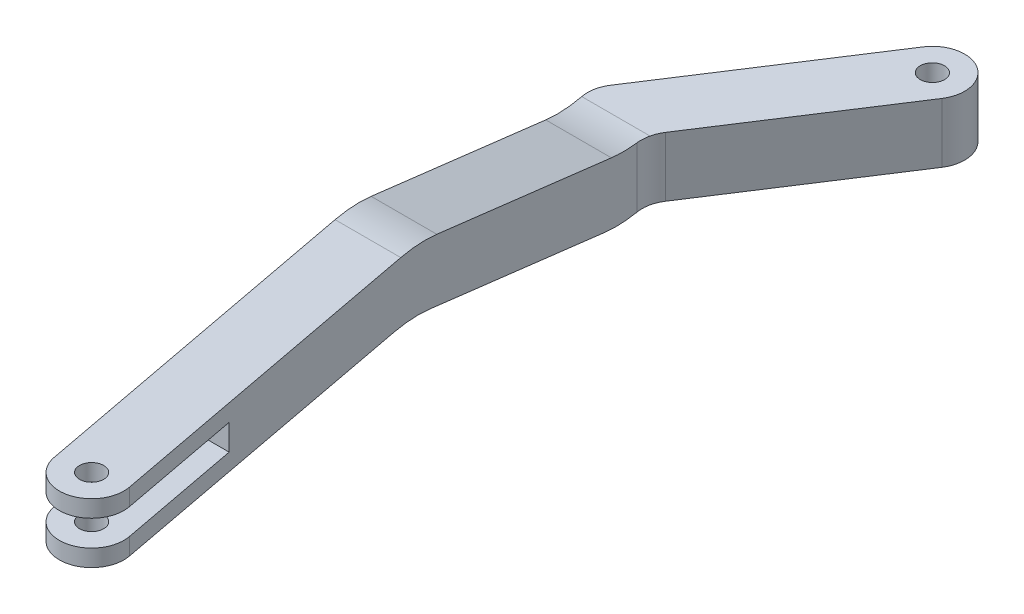
ISO-10303-21;
HEADER;
FILE_DESCRIPTION(('STEP AP214'),'2;1');
FILE_NAME('part.step','',(''),(''),'','','');
FILE_SCHEMA(('AUTOMOTIVE_DESIGN { 1 0 10303 214 1 1 1 1 }'));
ENDSEC;
DATA;
#1=APPLICATION_CONTEXT('core data for automotive mechanical design processes');
#2=APPLICATION_PROTOCOL_DEFINITION('international standard','automotive_design',2000,#1);
#3=PRODUCT_CONTEXT('',#1,'mechanical');
#4=PRODUCT('Part','Part','',(#3));
#5=PRODUCT_RELATED_PRODUCT_CATEGORY('part','',(#4));
#6=PRODUCT_DEFINITION_FORMATION('','',#4);
#7=PRODUCT_DEFINITION_CONTEXT('part definition',#1,'design');
#8=PRODUCT_DEFINITION('design','',#6,#7);
#9=PRODUCT_DEFINITION_SHAPE('','',#8);
#10=(LENGTH_UNIT() NAMED_UNIT(*) SI_UNIT(.MILLI.,.METRE.));
#11=(NAMED_UNIT(*) PLANE_ANGLE_UNIT() SI_UNIT($,.RADIAN.));
#12=(NAMED_UNIT(*) SI_UNIT($,.STERADIAN.) SOLID_ANGLE_UNIT());
#13=UNCERTAINTY_MEASURE_WITH_UNIT(LENGTH_MEASURE(1.E-05),#10,'distance_accuracy_value','');
#14=(GEOMETRIC_REPRESENTATION_CONTEXT(3) GLOBAL_UNCERTAINTY_ASSIGNED_CONTEXT((#13)) GLOBAL_UNIT_ASSIGNED_CONTEXT((#10,
#11,#12)) REPRESENTATION_CONTEXT('',''));
#15=CARTESIAN_POINT('',(0.,0.,0.));
#16=DIRECTION('',(0.,0.,1.));
#17=DIRECTION('',(1.,0.,0.));
#18=AXIS2_PLACEMENT_3D('',#15,#16,#17);
#19=CARTESIAN_POINT('',(10.,6.45,-22.5200010883989));
#20=DIRECTION('',(0.,-0.961261695938321,0.275637355816992));
#21=DIRECTION('',(0.,-0.275637355816992,-0.961261695938321));
#22=AXIS2_PLACEMENT_3D('',#19,#20,#21);
#23=PLANE('',#22);
#24=DIRECTION('',(0.178602453933735,0.271205470906492,0.945805876488001));
#25=VECTOR('',#24,1.);
#26=CARTESIAN_POINT('',(-5.76837346642499,7.23895461904974,-19.7685893543897));
#27=LINE('',#26,#25);
#28=CARTESIAN_POINT('',(-9.06216010888304,2.2373830406168,-37.2111423189214));
#29=VERTEX_POINT('',#28);
#30=CARTESIAN_POINT('',(-6.54305102720159,6.06261695938321,-23.8709662995449));
#31=VERTEX_POINT('',#30);
#32=EDGE_CURVE('E371',#29,#31,#27,.T.);
#33=ORIENTED_EDGE('',*,*,#32,.T.);
#34=DIRECTION('',(-1.,0.,0.));
#35=VECTOR('',#34,1.);
#36=CARTESIAN_POINT('',(10.,6.06261695938321,-23.8709662995449));
#37=LINE('',#36,#35);
#38=CARTESIAN_POINT('',(-2.47235745112013,6.06261695938321,-23.8709662995449));
#39=VERTEX_POINT('',#38);
#40=EDGE_CURVE('E263',#31,#39,#37,.F.);
#41=ORIENTED_EDGE('',*,*,#40,.T.);
#42=DIRECTION('',(-0.178602453933735,-0.271205470906492,-0.945805876488001));
#43=VECTOR('',#42,1.);
#44=CARTESIAN_POINT('',(-1.82753027937678,7.04177851575712,-20.4562241449926));
#45=LINE('',#44,#43);
#46=CARTESIAN_POINT('',(-4.99146653280159,2.2373830406168,-37.2111423189214));
#47=VERTEX_POINT('',#46);
#48=EDGE_CURVE('E167',#39,#47,#45,.T.);
#49=ORIENTED_EDGE('',*,*,#48,.T.);
#50=DIRECTION('',(-1.,0.,0.));
#51=VECTOR('',#50,1.);
#52=CARTESIAN_POINT('',(-9.31727134036083,2.2373830406168,-37.2111423189214));
#53=LINE('',#52,#51);
#54=EDGE_CURVE('E259',#47,#29,#53,.T.);
#55=ORIENTED_EDGE('',*,*,#54,.T.);
#56=EDGE_LOOP('',(#33,#41,#49,#55));
#57=FACE_BOUND('',#56,.T.);
#58=ADVANCED_FACE('F15',(#57),#23,.F.);
#59=CARTESIAN_POINT('',(10.,6.45,5.));
#60=DIRECTION('',(0.,-1.,0.));
#61=DIRECTION('',(0.,0.,-1.));
#62=AXIS2_PLACEMENT_3D('',#59,#60,#61);
#63=PLANE('',#62);
#64=CARTESIAN_POINT('',(0.,6.45,0.));
#65=DIRECTION('',(0.,-1.,0.));
#66=DIRECTION('',(0.,0.,-1.));
#67=AXIS2_PLACEMENT_3D('',#64,#65,#66);
#68=CIRCLE('',#67,0.75);
#69=CARTESIAN_POINT('',(0.,6.45,-0.75));
#70=VERTEX_POINT('',#69);
#71=EDGE_CURVE('E209',#70,#70,#68,.F.);
#72=ORIENTED_EDGE('',*,*,#71,.F.);
#73=EDGE_LOOP('',(#72));
#74=FACE_BOUND('',#73,.T.);
#75=DIRECTION('',(-0.185556850741548,0.,-0.982633530438932));
#76=VECTOR('',#75,1.);
#77=CARTESIAN_POINT('',(3.22125242615556,6.45,6.28007340764427));
#78=LINE('',#77,#76);
#79=CARTESIAN_POINT('',(1.96526706087786,6.45,-0.371113701483095));
#80=VERTEX_POINT('',#79);
#81=CARTESIAN_POINT('',(-1.95185414945403,6.45,-21.1145927413749));
#82=VERTEX_POINT('',#81);
#83=EDGE_CURVE('E153',#80,#82,#78,.T.);
#84=ORIENTED_EDGE('',*,*,#83,.T.);
#85=DIRECTION('',(-1.,0.,0.));
#86=VECTOR('',#85,1.);
#87=CARTESIAN_POINT('',(10.,6.45,-21.1145927413749));
#88=LINE('',#87,#86);
#89=CARTESIAN_POINT('',(-6.02254772553548,6.45,-21.1145927413749));
#90=VERTEX_POINT('',#89);
#91=EDGE_CURVE('E250',#82,#90,#88,.T.);
#92=ORIENTED_EDGE('',*,*,#91,.T.);
#93=DIRECTION('',(0.185556850741548,0.,0.982633530438932));
#94=VECTOR('',#93,1.);
#95=CARTESIAN_POINT('',(-0.709281695600169,6.45,7.02230081061046));
#96=LINE('',#95,#94);
#97=CARTESIAN_POINT('',(-1.96526706087786,6.45,0.371113701483095));
#98=VERTEX_POINT('',#97);
#99=EDGE_CURVE('E183',#90,#98,#96,.T.);
#100=ORIENTED_EDGE('',*,*,#99,.T.);
#101=CARTESIAN_POINT('',(0.,6.45,0.));
#102=DIRECTION('',(0.,-1.,0.));
#103=DIRECTION('',(0.,0.,-1.));
#104=AXIS2_PLACEMENT_3D('',#101,#102,#103);
#105=CIRCLE('',#104,2.);
#106=EDGE_CURVE('E173',#98,#80,#105,.F.);
#107=ORIENTED_EDGE('',*,*,#106,.T.);
#108=EDGE_LOOP('',(#84,#92,#100,#107));
#109=FACE_BOUND('',#108,.T.);
#110=ADVANCED_FACE('F181',(#74,#109),#63,.F.);
#111=CARTESIAN_POINT('',(10.,5.4,-8.));
#112=DIRECTION('',(0.,1.,0.));
#113=DIRECTION('',(0.,0.,1.));
#114=AXIS2_PLACEMENT_3D('',#111,#112,#113);
#115=PLANE('',#114);
#116=CARTESIAN_POINT('',(0.,5.4,0.));
#117=DIRECTION('',(0.,1.,0.));
#118=DIRECTION('',(0.,0.,1.));
#119=AXIS2_PLACEMENT_3D('',#116,#117,#118);
#120=CIRCLE('',#119,0.75);
#121=CARTESIAN_POINT('',(0.,5.4,0.75));
#122=VERTEX_POINT('',#121);
#123=EDGE_CURVE('E205',#122,#122,#120,.F.);
#124=ORIENTED_EDGE('',*,*,#123,.F.);
#125=EDGE_LOOP('',(#124));
#126=FACE_BOUND('',#125,.T.);
#127=CARTESIAN_POINT('',(0.,5.4,0.));
#128=DIRECTION('',(0.,1.,0.));
#129=DIRECTION('',(0.,0.,1.));
#130=AXIS2_PLACEMENT_3D('',#127,#128,#129);
#131=CIRCLE('',#130,2.);
#132=CARTESIAN_POINT('',(1.96526706087786,5.4,-0.371113701483095));
#133=VERTEX_POINT('',#132);
#134=CARTESIAN_POINT('',(-1.96526706087786,5.4,0.371113701483095));
#135=VERTEX_POINT('',#134);
#136=EDGE_CURVE('E176',#133,#135,#131,.F.);
#137=ORIENTED_EDGE('',*,*,#136,.T.);
#138=DIRECTION('',(-0.185556850741548,0.,-0.982633530438932));
#139=VECTOR('',#138,1.);
#140=CARTESIAN_POINT('',(-3.07962867903703,5.4,-5.53009170624697));
#141=LINE('',#140,#139);
#142=CARTESIAN_POINT('',(-3.54603694866378,5.4,-8.));
#143=VERTEX_POINT('',#142);
#144=EDGE_CURVE('E389',#135,#143,#141,.T.);
#145=ORIENTED_EDGE('',*,*,#144,.T.);
#146=DIRECTION('',(-1.,0.,0.));
#147=VECTOR('',#146,1.);
#148=CARTESIAN_POINT('',(10.,5.4,-8.));
#149=LINE('',#148,#147);
#150=CARTESIAN_POINT('',(0.524656627417675,5.4,-8.));
#151=VERTEX_POINT('',#150);
#152=EDGE_CURVE('E217',#151,#143,#149,.T.);
#153=ORIENTED_EDGE('',*,*,#152,.F.);
#154=DIRECTION('',(0.185556850741548,0.,0.982633530438932));
#155=VECTOR('',#154,1.);
#156=CARTESIAN_POINT('',(0.850905442718694,5.4,-6.27231910921316));
#157=LINE('',#156,#155);
#158=EDGE_CURVE('E368',#151,#133,#157,.T.);
#159=ORIENTED_EDGE('',*,*,#158,.T.);
#160=EDGE_LOOP('',(#137,#145,#153,#159));
#161=FACE_BOUND('',#160,.T.);
#162=ADVANCED_FACE('F474',(#126,#161),#115,.F.);
#163=CARTESIAN_POINT('',(10.,3.8,-8.));
#164=DIRECTION('',(0.,0.,-1.));
#165=DIRECTION('',(-1.,0.,0.));
#166=AXIS2_PLACEMENT_3D('',#163,#164,#165);
#167=PLANE('',#166);
#168=ORIENTED_EDGE('',*,*,#152,.T.);
#169=DIRECTION('',(0.,-1.,0.));
#170=VECTOR('',#169,1.);
#171=CARTESIAN_POINT('',(-3.54603694866378,3.8,-8.));
#172=LINE('',#171,#170);
#173=CARTESIAN_POINT('',(-3.54603694866378,3.8,-8.));
#174=VERTEX_POINT('',#173);
#175=EDGE_CURVE('E385',#143,#174,#172,.T.);
#176=ORIENTED_EDGE('',*,*,#175,.T.);
#177=DIRECTION('',(-1.,0.,0.));
#178=VECTOR('',#177,1.);
#179=CARTESIAN_POINT('',(10.,3.8,-8.));
#180=LINE('',#179,#178);
#181=CARTESIAN_POINT('',(0.524656627417677,3.8,-8.));
#182=VERTEX_POINT('',#181);
#183=EDGE_CURVE('E213',#182,#174,#180,.T.);
#184=ORIENTED_EDGE('',*,*,#183,.F.);
#185=DIRECTION('',(0.,1.,0.));
#186=VECTOR('',#185,1.);
#187=CARTESIAN_POINT('',(0.524656627417675,3.8,-8.));
#188=LINE('',#187,#186);
#189=EDGE_CURVE('E364',#182,#151,#188,.T.);
#190=ORIENTED_EDGE('',*,*,#189,.T.);
#191=EDGE_LOOP('',(#168,#176,#184,#190));
#192=FACE_BOUND('',#191,.T.);
#193=ADVANCED_FACE('F472',(#192),#167,.F.);
#194=CARTESIAN_POINT('',(10.,3.8,5.));
#195=DIRECTION('',(0.,-1.,0.));
#196=DIRECTION('',(0.,0.,-1.));
#197=AXIS2_PLACEMENT_3D('',#194,#195,#196);
#198=PLANE('',#197);
#199=CARTESIAN_POINT('',(0.,3.8,0.));
#200=DIRECTION('',(0.,-1.,0.));
#201=DIRECTION('',(0.,0.,-1.));
#202=AXIS2_PLACEMENT_3D('',#199,#200,#201);
#203=CIRCLE('',#202,0.75);
#204=CARTESIAN_POINT('',(0.,3.8,-0.75));
#205=VERTEX_POINT('',#204);
#206=EDGE_CURVE('E201',#205,#205,#203,.F.);
#207=ORIENTED_EDGE('',*,*,#206,.F.);
#208=EDGE_LOOP('',(#207));
#209=FACE_BOUND('',#208,.T.);
#210=ORIENTED_EDGE('',*,*,#183,.T.);
#211=DIRECTION('',(0.185556850741548,0.,0.982633530438932));
#212=VECTOR('',#211,1.);
#213=CARTESIAN_POINT('',(-0.709281695600169,3.8,7.02230081061046));
#214=LINE('',#213,#212);
#215=CARTESIAN_POINT('',(-1.96526706087786,3.8,0.371113701483095));
#216=VERTEX_POINT('',#215);
#217=EDGE_CURVE('E342',#174,#216,#214,.T.);
#218=ORIENTED_EDGE('',*,*,#217,.T.);
#219=CARTESIAN_POINT('',(0.,3.8,0.));
#220=DIRECTION('',(0.,-1.,0.));
#221=DIRECTION('',(0.,0.,-1.));
#222=AXIS2_PLACEMENT_3D('',#219,#220,#221);
#223=CIRCLE('',#222,2.);
#224=CARTESIAN_POINT('',(1.96526706087786,3.8,-0.371113701483095));
#225=VERTEX_POINT('',#224);
#226=EDGE_CURVE('E193',#216,#225,#223,.F.);
#227=ORIENTED_EDGE('',*,*,#226,.T.);
#228=DIRECTION('',(-0.185556850741548,0.,-0.982633530438932));
#229=VECTOR('',#228,1.);
#230=CARTESIAN_POINT('',(3.22125242615556,3.8,6.28007340764427));
#231=LINE('',#230,#229);
#232=EDGE_CURVE('E357',#225,#182,#231,.T.);
#233=ORIENTED_EDGE('',*,*,#232,.T.);
#234=EDGE_LOOP('',(#210,#218,#227,#233));
#235=FACE_BOUND('',#234,.T.);
#236=ADVANCED_FACE('F415',(#209,#235),#198,.F.);
#237=CARTESIAN_POINT('',(10.,2.75,-22.));
#238=DIRECTION('',(0.,1.,0.));
#239=DIRECTION('',(0.,0.,1.));
#240=AXIS2_PLACEMENT_3D('',#237,#238,#239);
#241=PLANE('',#240);
#242=CARTESIAN_POINT('',(0.,2.75,0.));
#243=DIRECTION('',(0.,1.,0.));
#244=DIRECTION('',(0.,0.,1.));
#245=AXIS2_PLACEMENT_3D('',#242,#243,#244);
#246=CIRCLE('',#245,0.75);
#247=CARTESIAN_POINT('',(0.,2.75,0.75));
#248=VERTEX_POINT('',#247);
#249=EDGE_CURVE('E200',#248,#248,#246,.F.);
#250=ORIENTED_EDGE('',*,*,#249,.F.);
#251=EDGE_LOOP('',(#250));
#252=FACE_BOUND('',#251,.T.);
#253=DIRECTION('',(-0.185556850741548,0.,-0.982633530438932));
#254=VECTOR('',#253,1.);
#255=CARTESIAN_POINT('',(-5.63231004581519,2.75,-19.0480528782472));
#256=LINE('',#255,#254);
#257=CARTESIAN_POINT('',(-1.96526706087786,2.75,0.371113701483095));
#258=VERTEX_POINT('',#257);
#259=CARTESIAN_POINT('',(-5.9243526595658,2.75,-20.5945916529761));
#260=VERTEX_POINT('',#259);
#261=EDGE_CURVE('E330',#258,#260,#256,.T.);
#262=ORIENTED_EDGE('',*,*,#261,.T.);
#263=DIRECTION('',(-1.,0.,0.));
#264=VECTOR('',#263,1.);
#265=CARTESIAN_POINT('',(-2.11905115367266,2.75,-20.5945916529761));
#266=LINE('',#265,#264);
#267=CARTESIAN_POINT('',(-1.85365908348435,2.75,-20.5945916529761));
#268=VERTEX_POINT('',#267);
#269=EDGE_CURVE('E278',#260,#268,#266,.F.);
#270=ORIENTED_EDGE('',*,*,#269,.T.);
#271=DIRECTION('',(0.185556850741548,0.,0.982633530438932));
#272=VECTOR('',#271,1.);
#273=CARTESIAN_POINT('',(-1.70177592405946,2.75,-19.7902802812134));
#274=LINE('',#273,#272);
#275=CARTESIAN_POINT('',(1.96526706087786,2.75,-0.371113701483095));
#276=VERTEX_POINT('',#275);
#277=EDGE_CURVE('E350',#268,#276,#274,.T.);
#278=ORIENTED_EDGE('',*,*,#277,.T.);
#279=CARTESIAN_POINT('',(0.,2.75,0.));
#280=DIRECTION('',(0.,1.,0.));
#281=DIRECTION('',(0.,0.,1.));
#282=AXIS2_PLACEMENT_3D('',#279,#280,#281);
#283=CIRCLE('',#282,2.);
#284=EDGE_CURVE('E246',#276,#258,#283,.F.);
#285=ORIENTED_EDGE('',*,*,#284,.T.);
#286=EDGE_LOOP('',(#262,#270,#278,#285));
#287=FACE_BOUND('',#286,.T.);
#288=ADVANCED_FACE('F338',(#252,#287),#241,.F.);
#289=CARTESIAN_POINT('',(10.,-1.85,-38.0421064416686));
#290=DIRECTION('',(0.,0.961261695938321,-0.275637355816992));
#291=DIRECTION('',(0.,0.275637355816992,0.961261695938321));
#292=AXIS2_PLACEMENT_3D('',#289,#290,#291);
#293=PLANE('',#292);
#294=DIRECTION('',(0.178602453933735,0.271205470906492,0.945805876488001));
#295=VECTOR('',#294,1.);
#296=CARTESIAN_POINT('',(-4.66516691460203,-1.1162432050429,-35.4831923966687));
#297=LINE('',#296,#295);
#298=CARTESIAN_POINT('',(-4.89327146683191,-1.46261695938321,-36.6911412305225));
#299=VERTEX_POINT('',#298);
#300=CARTESIAN_POINT('',(-2.37416238515046,2.36261695938321,-23.3509652111461));
#301=VERTEX_POINT('',#300);
#302=EDGE_CURVE('E166',#299,#301,#297,.T.);
#303=ORIENTED_EDGE('',*,*,#302,.T.);
#304=DIRECTION('',(-1.,0.,0.));
#305=VECTOR('',#304,1.);
#306=CARTESIAN_POINT('',(-6.18974472975411,2.36261695938321,-23.3509652111461));
#307=LINE('',#306,#305);
#308=CARTESIAN_POINT('',(-6.4448559612319,2.36261695938321,-23.3509652111461));
#309=VERTEX_POINT('',#308);
#310=EDGE_CURVE('E274',#301,#309,#307,.T.);
#311=ORIENTED_EDGE('',*,*,#310,.T.);
#312=DIRECTION('',(-0.178602453933735,-0.271205470906492,-0.945805876488001));
#313=VECTOR('',#312,1.);
#314=CARTESIAN_POINT('',(-8.60601010165023,-0.919067101750281,-34.7955576060657));
#315=LINE('',#314,#313);
#316=CARTESIAN_POINT('',(-8.96396504291336,-1.46261695938321,-36.6911412305225));
#317=VERTEX_POINT('',#316);
#318=EDGE_CURVE('E333',#309,#317,#315,.T.);
#319=ORIENTED_EDGE('',*,*,#318,.T.);
#320=DIRECTION('',(-1.,0.,0.));
#321=VECTOR('',#320,1.);
#322=CARTESIAN_POINT('',(10.,-1.46261695938321,-36.6911412305225));
#323=LINE('',#322,#321);
#324=EDGE_CURVE('E271',#317,#299,#323,.F.);
#325=ORIENTED_EDGE('',*,*,#324,.T.);
#326=EDGE_LOOP('',(#303,#311,#319,#325));
#327=FACE_BOUND('',#326,.T.);
#328=ADVANCED_FACE('F352',(#327),#293,.F.);
#329=CARTESIAN_POINT('',(10.,-1.85,-57.12));
#330=DIRECTION('',(0.,1.,0.));
#331=DIRECTION('',(0.,0.,1.));
#332=AXIS2_PLACEMENT_3D('',#329,#330,#331);
#333=PLANE('',#332);
#334=CARTESIAN_POINT('',(0.,-1.85,-52.12));
#335=DIRECTION('',(0.,1.,0.));
#336=DIRECTION('',(0.,0.,1.));
#337=AXIS2_PLACEMENT_3D('',#334,#335,#336);
#338=CIRCLE('',#337,0.75);
#339=CARTESIAN_POINT('',(0.,-1.85,-51.37));
#340=VERTEX_POINT('',#339);
#341=EDGE_CURVE('E191',#340,#340,#338,.F.);
#342=ORIENTED_EDGE('',*,*,#341,.F.);
#343=EDGE_LOOP('',(#342));
#344=FACE_BOUND('',#343,.T.);
#345=CARTESIAN_POINT('',(-3.39683910958896,-1.85,-39.5450126323222));
#346=DIRECTION('',(0.,1.,0.));
#347=DIRECTION('',(0.,0.,1.));
#348=AXIS2_PLACEMENT_3D('',#345,#346,#347);
#349=CIRCLE('',#348,2.);
#350=CARTESIAN_POINT('',(-5.07418024547981,-1.85,-40.6342907023522));
#351=VERTEX_POINT('',#350);
#352=CARTESIAN_POINT('',(-5.39446123864329,-1.85,-39.4475147886925));
#353=VERTEX_POINT('',#352);
#354=EDGE_CURVE('E409',#351,#353,#349,.T.);
#355=ORIENTED_EDGE('',*,*,#354,.T.);
#356=DIRECTION('',(-1.,0.,0.));
#357=VECTOR('',#356,1.);
#358=CARTESIAN_POINT('',(10.,-1.85,-39.4475147886925));
#359=LINE('',#358,#357);
#360=CARTESIAN_POINT('',(-9.48446834457947,-1.85,-39.4475147886925));
#361=VERTEX_POINT('',#360);
#362=EDGE_CURVE('E281',#353,#361,#359,.T.);
#363=ORIENTED_EDGE('',*,*,#362,.T.);
#364=DIRECTION('',(-0.185556850741548,0.,-0.982633530438932));
#365=VECTOR('',#364,1.);
#366=CARTESIAN_POINT('',(-12.0358935887615,-1.85,-52.9588240468652));
#367=LINE('',#366,#365);
#368=CARTESIAN_POINT('',(-9.59021355108826,-1.85,-40.007498347281));
#369=VERTEX_POINT('',#368);
#370=EDGE_CURVE('E377',#361,#369,#367,.T.);
#371=ORIENTED_EDGE('',*,*,#370,.T.);
#372=CARTESIAN_POINT('',(-7.62494649021039,-1.85,-40.378612048764));
#373=DIRECTION('',(0.,1.,0.));
#374=DIRECTION('',(0.,0.,1.));
#375=AXIS2_PLACEMENT_3D('',#372,#373,#374);
#376=CIRCLE('',#375,2.);
#377=CARTESIAN_POINT('',(-9.30228762610125,-1.85,-41.4678901187941));
#378=VERTEX_POINT('',#377);
#379=EDGE_CURVE('E393',#369,#378,#376,.F.);
#380=ORIENTED_EDGE('',*,*,#379,.T.);
#381=DIRECTION('',(0.544639035015028,0.,-0.838670567945423));
#382=VECTOR('',#381,1.);
#383=CARTESIAN_POINT('',(3.57283929283667,-1.85,-61.2938469659326));
#384=LINE('',#383,#382);
#385=CARTESIAN_POINT('',(-1.67734113589084,-1.85,-53.2092780700301));
#386=VERTEX_POINT('',#385);
#387=EDGE_CURVE('E397',#378,#386,#384,.T.);
#388=ORIENTED_EDGE('',*,*,#387,.T.);
#389=CARTESIAN_POINT('',(0.,-1.85,-52.12));
#390=DIRECTION('',(0.,1.,0.));
#391=DIRECTION('',(0.,0.,1.));
#392=AXIS2_PLACEMENT_3D('',#389,#390,#391);
#393=CIRCLE('',#392,2.);
#394=CARTESIAN_POINT('',(1.67734113589085,-1.85,-51.03072192997));
#395=VERTEX_POINT('',#394);
#396=EDGE_CURVE('E401',#386,#395,#393,.F.);
#397=ORIENTED_EDGE('',*,*,#396,.T.);
#398=DIRECTION('',(-0.544639035015028,0.,0.838670567945424));
#399=VECTOR('',#398,1.);
#400=CARTESIAN_POINT('',(6.92752156461836,-1.85,-59.1152908258725));
#401=LINE('',#400,#399);
#402=EDGE_CURVE('E405',#395,#351,#401,.T.);
#403=ORIENTED_EDGE('',*,*,#402,.T.);
#404=EDGE_LOOP('',(#355,#363,#371,#380,#388,#397,#403));
#405=FACE_BOUND('',#404,.T.);
#406=ADVANCED_FACE('F463',(#344,#405),#333,.F.);
#407=CARTESIAN_POINT('',(10.,1.85,-38.5621075300674));
#408=DIRECTION('',(0.,-1.,0.));
#409=DIRECTION('',(0.,0.,-1.));
#410=AXIS2_PLACEMENT_3D('',#407,#408,#409);
#411=PLANE('',#410);
#412=CARTESIAN_POINT('',(0.,1.85,-52.12));
#413=DIRECTION('',(0.,-1.,0.));
#414=DIRECTION('',(0.,0.,-1.));
#415=AXIS2_PLACEMENT_3D('',#412,#413,#414);
#416=CIRCLE('',#415,0.75);
#417=CARTESIAN_POINT('',(0.,1.85,-52.87));
#418=VERTEX_POINT('',#417);
#419=EDGE_CURVE('E185',#418,#418,#416,.F.);
#420=ORIENTED_EDGE('',*,*,#419,.F.);
#421=EDGE_LOOP('',(#420));
#422=FACE_BOUND('',#421,.T.);
#423=DIRECTION('',(0.185556850741548,0.,0.982633530438932));
#424=VECTOR('',#423,1.);
#425=CARTESIAN_POINT('',(-8.65215170914229,1.85,-35.0399047723863));
#426=LINE('',#425,#424);
#427=CARTESIAN_POINT('',(-9.59021355108826,1.85,-40.007498347281));
#428=VERTEX_POINT('',#427);
#429=CARTESIAN_POINT('',(-9.58266341054914,1.85,-39.9675158770913));
#430=VERTEX_POINT('',#429);
#431=EDGE_CURVE('E243',#428,#430,#426,.T.);
#432=ORIENTED_EDGE('',*,*,#431,.T.);
#433=DIRECTION('',(-1.,0.,0.));
#434=VECTOR('',#433,1.);
#435=CARTESIAN_POINT('',(-5.24657776427938,1.85,-39.9675158770913));
#436=LINE('',#435,#434);
#437=CARTESIAN_POINT('',(-5.35170253401523,1.85,-39.9675158770913));
#438=VERTEX_POINT('',#437);
#439=EDGE_CURVE('E39',#430,#438,#436,.F.);
#440=ORIENTED_EDGE('',*,*,#439,.T.);
#441=CARTESIAN_POINT('',(-3.39683910958896,1.85,-39.5450126323222));
#442=DIRECTION('',(0.,-1.,0.));
#443=DIRECTION('',(0.,0.,-1.));
#444=AXIS2_PLACEMENT_3D('',#441,#442,#443);
#445=CIRCLE('',#444,2.);
#446=CARTESIAN_POINT('',(-5.07418024547981,1.85,-40.6342907023522));
#447=VERTEX_POINT('',#446);
#448=EDGE_CURVE('E220',#438,#447,#445,.T.);
#449=ORIENTED_EDGE('',*,*,#448,.T.);
#450=DIRECTION('',(0.544639035015028,0.,-0.838670567945424));
#451=VECTOR('',#450,1.);
#452=CARTESIAN_POINT('',(-1.54921762004501,1.85,-46.0622571480152));
#453=LINE('',#452,#451);
#454=CARTESIAN_POINT('',(1.67734113589085,1.85,-51.03072192997));
#455=VERTEX_POINT('',#454);
#456=EDGE_CURVE('E227',#447,#455,#453,.T.);
#457=ORIENTED_EDGE('',*,*,#456,.T.);
#458=CARTESIAN_POINT('',(0.,1.85,-52.12));
#459=DIRECTION('',(0.,-1.,0.));
#460=DIRECTION('',(0.,0.,-1.));
#461=AXIS2_PLACEMENT_3D('',#458,#459,#460);
#462=CIRCLE('',#461,2.);
#463=CARTESIAN_POINT('',(-1.67734113589084,1.85,-53.2092780700301));
#464=VERTEX_POINT('',#463);
#465=EDGE_CURVE('E231',#455,#464,#462,.F.);
#466=ORIENTED_EDGE('',*,*,#465,.T.);
#467=DIRECTION('',(-0.544639035015028,0.,0.838670567945423));
#468=VECTOR('',#467,1.);
#469=CARTESIAN_POINT('',(-4.9038998918267,1.85,-48.2408132880753));
#470=LINE('',#469,#468);
#471=CARTESIAN_POINT('',(-9.30228762610125,1.85,-41.4678901187941));
#472=VERTEX_POINT('',#471);
#473=EDGE_CURVE('E235',#464,#472,#470,.T.);
#474=ORIENTED_EDGE('',*,*,#473,.T.);
#475=CARTESIAN_POINT('',(-7.62494649021039,1.85,-40.378612048764));
#476=DIRECTION('',(0.,-1.,0.));
#477=DIRECTION('',(0.,0.,-1.));
#478=AXIS2_PLACEMENT_3D('',#475,#476,#477);
#479=CIRCLE('',#478,2.);
#480=EDGE_CURVE('E239',#472,#428,#479,.F.);
#481=ORIENTED_EDGE('',*,*,#480,.T.);
#482=EDGE_LOOP('',(#432,#440,#449,#457,#466,#474,#481));
#483=FACE_BOUND('',#482,.T.);
#484=ADVANCED_FACE('F454',(#422,#483),#411,.F.);
#485=CARTESIAN_POINT('',(0.,26.,-52.12));
#486=DIRECTION('',(0.,-1.,0.));
#487=DIRECTION('',(0.,0.,-1.));
#488=AXIS2_PLACEMENT_3D('',#485,#486,#487);
#489=CYLINDRICAL_SURFACE('',#488,0.75);
#490=ORIENTED_EDGE('',*,*,#419,.T.);
#491=EDGE_LOOP('',(#490));
#492=FACE_BOUND('',#491,.T.);
#493=ORIENTED_EDGE('',*,*,#341,.T.);
#494=EDGE_LOOP('',(#493));
#495=FACE_BOUND('',#494,.T.);
#496=ADVANCED_FACE('F512',(#492,#495),#489,.F.);
#497=CARTESIAN_POINT('',(0.,26.,0.));
#498=DIRECTION('',(0.,-1.,0.));
#499=DIRECTION('',(0.,0.,-1.));
#500=AXIS2_PLACEMENT_3D('',#497,#498,#499);
#501=CYLINDRICAL_SURFACE('',#500,0.75);
#502=ORIENTED_EDGE('',*,*,#249,.T.);
#503=EDGE_LOOP('',(#502));
#504=FACE_BOUND('',#503,.T.);
#505=ORIENTED_EDGE('',*,*,#206,.T.);
#506=EDGE_LOOP('',(#505));
#507=FACE_BOUND('',#506,.T.);
#508=ADVANCED_FACE('F515',(#504,#507),#501,.F.);
#509=ORIENTED_EDGE('',*,*,#123,.T.);
#510=EDGE_LOOP('',(#509));
#511=FACE_BOUND('',#510,.T.);
#512=ORIENTED_EDGE('',*,*,#71,.T.);
#513=EDGE_LOOP('',(#512));
#514=FACE_BOUND('',#513,.T.);
#515=ADVANCED_FACE('F306',(#511,#514),#501,.F.);
#516=CARTESIAN_POINT('',(0.,11.,0.));
#517=DIRECTION('',(0.,-1.,0.));
#518=DIRECTION('',(0.,0.,-1.));
#519=AXIS2_PLACEMENT_3D('',#516,#517,#518);
#520=CYLINDRICAL_SURFACE('',#519,2.);
#521=DIRECTION('',(0.,-1.,0.));
#522=VECTOR('',#521,1.);
#523=CARTESIAN_POINT('',(-1.96526706087786,11.,0.371113701483095));
#524=LINE('',#523,#522);
#525=EDGE_CURVE('E420',#98,#135,#524,.T.);
#526=ORIENTED_EDGE('',*,*,#525,.T.);
#527=ORIENTED_EDGE('',*,*,#136,.F.);
#528=DIRECTION('',(0.,-1.,0.));
#529=VECTOR('',#528,1.);
#530=CARTESIAN_POINT('',(1.96526706087786,11.,-0.371113701483095));
#531=LINE('',#530,#529);
#532=EDGE_CURVE('E157',#80,#133,#531,.T.);
#533=ORIENTED_EDGE('',*,*,#532,.F.);
#534=ORIENTED_EDGE('',*,*,#106,.F.);
#535=EDGE_LOOP('',(#526,#527,#533,#534));
#536=FACE_BOUND('',#535,.T.);
#537=ADVANCED_FACE('F172',(#536),#520,.T.);
#538=EDGE_CURVE('E178',#216,#258,#524,.T.);
#539=ORIENTED_EDGE('',*,*,#538,.T.);
#540=ORIENTED_EDGE('',*,*,#284,.F.);
#541=EDGE_CURVE('E179',#225,#276,#531,.T.);
#542=ORIENTED_EDGE('',*,*,#541,.F.);
#543=ORIENTED_EDGE('',*,*,#226,.F.);
#544=EDGE_LOOP('',(#539,#540,#542,#543));
#545=FACE_BOUND('',#544,.T.);
#546=ADVANCED_FACE('F303',(#545),#520,.T.);
#547=CARTESIAN_POINT('',(-3.39683910958896,11.,-39.5450126323222));
#548=DIRECTION('',(0.,-1.,0.));
#549=DIRECTION('',(0.,0.,-1.));
#550=AXIS2_PLACEMENT_3D('',#547,#548,#549);
#551=CYLINDRICAL_SURFACE('',#550,2.);
#552=DIRECTION('',(0.,-1.,0.));
#553=VECTOR('',#552,1.);
#554=CARTESIAN_POINT('',(-5.36210617046683,11.,-39.1738989308391));
#555=LINE('',#554,#553);
#556=CARTESIAN_POINT('',(-5.36210617046683,1.88154113502888,-39.1738989308391));
#557=VERTEX_POINT('',#556);
#558=CARTESIAN_POINT('',(-5.36210617046683,-1.84625601724622,-39.1738989308391));
#559=VERTEX_POINT('',#558);
#560=EDGE_CURVE('E31',#557,#559,#555,.T.);
#561=ORIENTED_EDGE('',*,*,#560,.T.);
#562=CARTESIAN_POINT('',(-5.36210617046683,-1.84625601724622,-39.1738989308391));
#563=CARTESIAN_POINT('',(-5.37064256415289,-1.84749888590275,-39.2191213415723));
#564=CARTESIAN_POINT('',(-5.3776070166773,-1.84843231879383,-39.2645338684269));
#565=CARTESIAN_POINT('',(-5.38839203940275,-1.84968031304509,-39.355739154378));
#566=CARTESIAN_POINT('',(-5.39221260960384,-1.84999487440527,-39.4015319134746));
#567=CARTESIAN_POINT('',(-5.39446123864331,-1.85,-39.4475147886925));
#568=B_SPLINE_CURVE_WITH_KNOTS('',3,(#562,#563,#564,#565,#566,#567),.UNSPECIFIED.,.F.,.F.,(4,2,
4),(0.,0.137858813360538,0.275717626719347),.UNSPECIFIED.);
#569=EDGE_CURVE('E285',#559,#353,#568,.T.);
#570=ORIENTED_EDGE('',*,*,#569,.T.);
#571=ORIENTED_EDGE('',*,*,#354,.F.);
#572=DIRECTION('',(0.,-1.,0.));
#573=VECTOR('',#572,1.);
#574=CARTESIAN_POINT('',(-5.07418024547981,11.,-40.6342907023522));
#575=LINE('',#574,#573);
#576=EDGE_CURVE('E441',#447,#351,#575,.T.);
#577=ORIENTED_EDGE('',*,*,#576,.F.);
#578=ORIENTED_EDGE('',*,*,#448,.F.);
#579=CARTESIAN_POINT('',(-5.35170253401523,1.85,-39.9675158770913));
#580=CARTESIAN_POINT('',(-5.36348851566981,1.84999528947677,-39.9130169337566));
#581=CARTESIAN_POINT('',(-5.37298195689614,1.8504452852857,-39.8580227795795));
#582=CARTESIAN_POINT('',(-5.38734843517342,1.85227037679174,-39.7474348623415));
#583=CARTESIAN_POINT('',(-5.39222028213613,1.8536457106132,-39.6918409485642));
#584=CARTESIAN_POINT('',(-5.3972595666512,1.85730625716752,-39.5814058275021));
#585=CARTESIAN_POINT('',(-5.39750446207343,1.85957583811568,-39.5265676162743));
#586=CARTESIAN_POINT('',(-5.39349609117884,1.86500825844475,-39.417121870583));
#587=CARTESIAN_POINT('',(-5.38924468170796,1.86817072869258,-39.3625142502387));
#588=CARTESIAN_POINT('',(-5.37740426020438,1.87473141959272,-39.2631950040571));
#589=CARTESIAN_POINT('',(-5.37051175159091,1.8779964521345,-39.2183906203166));
#590=CARTESIAN_POINT('',(-5.36210617046683,1.88154113502888,-39.1738989308391));
#591=B_SPLINE_CURVE_WITH_KNOTS('',3,(#579,#580,#581,#582,#583,#584,#585,#586,#587,#588,#589,
#590),.UNSPECIFIED.,.F.,.F.,(4,2,2,2,2,4),(0.,0.167225423968959,0.33449389780775,
0.498959671827775,0.663357552676153,0.799593388692315),.UNSPECIFIED.);
#592=EDGE_CURVE('E25',#438,#557,#591,.T.);
#593=ORIENTED_EDGE('',*,*,#592,.T.);
#594=EDGE_LOOP('',(#561,#570,#571,#577,#578,#593));
#595=FACE_BOUND('',#594,.T.);
#596=ADVANCED_FACE('F297',(#595),#551,.F.);
#597=CARTESIAN_POINT('',(-5.07418024547981,11.,-40.6342907023522));
#598=DIRECTION('',(-0.838670567945424,0.,-0.544639035015028));
#599=DIRECTION('',(-0.544639035015028,0.,0.838670567945424));
#600=AXIS2_PLACEMENT_3D('',#597,#598,#599);
#601=PLANE('',#600);
#602=DIRECTION('',(0.,-1.,0.));
#603=VECTOR('',#602,1.);
#604=CARTESIAN_POINT('',(1.67734113589085,11.,-51.03072192997));
#605=LINE('',#604,#603);
#606=EDGE_CURVE('E437',#455,#395,#605,.T.);
#607=ORIENTED_EDGE('',*,*,#606,.F.);
#608=ORIENTED_EDGE('',*,*,#456,.F.);
#609=ORIENTED_EDGE('',*,*,#576,.T.);
#610=ORIENTED_EDGE('',*,*,#402,.F.);
#611=EDGE_LOOP('',(#607,#608,#609,#610));
#612=FACE_BOUND('',#611,.T.);
#613=ADVANCED_FACE('F302',(#612),#601,.F.);
#614=CARTESIAN_POINT('',(0.,11.,-52.12));
#615=DIRECTION('',(0.,-1.,0.));
#616=DIRECTION('',(0.,0.,-1.));
#617=AXIS2_PLACEMENT_3D('',#614,#615,#616);
#618=CYLINDRICAL_SURFACE('',#617,2.);
#619=DIRECTION('',(0.,-1.,0.));
#620=VECTOR('',#619,1.);
#621=CARTESIAN_POINT('',(-1.67734113589084,11.,-53.2092780700301));
#622=LINE('',#621,#620);
#623=EDGE_CURVE('E433',#464,#386,#622,.T.);
#624=ORIENTED_EDGE('',*,*,#623,.F.);
#625=ORIENTED_EDGE('',*,*,#465,.F.);
#626=ORIENTED_EDGE('',*,*,#606,.T.);
#627=ORIENTED_EDGE('',*,*,#396,.F.);
#628=EDGE_LOOP('',(#624,#625,#626,#627));
#629=FACE_BOUND('',#628,.T.);
#630=ADVANCED_FACE('F551',(#629),#618,.T.);
#631=CARTESIAN_POINT('',(-9.30228762610125,11.,-41.4678901187941));
#632=DIRECTION('',(0.838670567945423,0.,0.544639035015028));
#633=DIRECTION('',(0.544639035015028,0.,-0.838670567945423));
#634=AXIS2_PLACEMENT_3D('',#631,#632,#633);
#635=PLANE('',#634);
#636=DIRECTION('',(0.,-1.,0.));
#637=VECTOR('',#636,1.);
#638=CARTESIAN_POINT('',(-9.30228762610125,11.,-41.4678901187941));
#639=LINE('',#638,#637);
#640=EDGE_CURVE('E429',#472,#378,#639,.T.);
#641=ORIENTED_EDGE('',*,*,#640,.F.);
#642=ORIENTED_EDGE('',*,*,#473,.F.);
#643=ORIENTED_EDGE('',*,*,#623,.T.);
#644=ORIENTED_EDGE('',*,*,#387,.F.);
#645=EDGE_LOOP('',(#641,#642,#643,#644));
#646=FACE_BOUND('',#645,.T.);
#647=ADVANCED_FACE('F460',(#646),#635,.F.);
#648=CARTESIAN_POINT('',(-7.62494649021039,11.,-40.378612048764));
#649=DIRECTION('',(0.,-1.,0.));
#650=DIRECTION('',(0.,0.,-1.));
#651=AXIS2_PLACEMENT_3D('',#648,#649,#650);
#652=CYLINDRICAL_SURFACE('',#651,2.);
#653=DIRECTION('',(0.,-1.,0.));
#654=VECTOR('',#653,1.);
#655=CARTESIAN_POINT('',(-9.59021355108826,11.,-40.007498347281));
#656=LINE('',#655,#654);
#657=EDGE_CURVE('E423',#428,#369,#656,.T.);
#658=ORIENTED_EDGE('',*,*,#657,.F.);
#659=ORIENTED_EDGE('',*,*,#480,.F.);
#660=ORIENTED_EDGE('',*,*,#640,.T.);
#661=ORIENTED_EDGE('',*,*,#379,.F.);
#662=EDGE_LOOP('',(#658,#659,#660,#661));
#663=FACE_BOUND('',#662,.T.);
#664=ADVANCED_FACE('F457',(#663),#652,.T.);
#665=CARTESIAN_POINT('',(-1.96526706087786,11.,0.371113701483096));
#666=DIRECTION('',(0.982633530438932,0.,-0.185556850741548));
#667=DIRECTION('',(-0.185556850741548,0.,-0.982633530438932));
#668=AXIS2_PLACEMENT_3D('',#665,#666,#667);
#669=PLANE('',#668);
#670=ORIENTED_EDGE('',*,*,#99,.F.);
#671=CARTESIAN_POINT('',(-6.02254772553548,-3.55,-21.1145927413749));
#672=DIRECTION('',(0.982633530438932,0.,-0.185556850741548));
#673=DIRECTION('',(-0.185556850741548,0.,-0.982633530438932));
#674=AXIS2_PLACEMENT_3D('',#671,#672,#673);
#675=ELLIPSE('',#674,10.1767339402036,10.);
#676=EDGE_CURVE('E256',#90,#31,#675,.F.);
#677=ORIENTED_EDGE('',*,*,#676,.T.);
#678=ORIENTED_EDGE('',*,*,#32,.F.);
#679=CARTESIAN_POINT('',(-9.58266341054915,11.85,-39.9675158770913));
#680=DIRECTION('',(0.982633530438932,0.,-0.185556850741548));
#681=DIRECTION('',(0.185556850741548,0.,0.982633530438932));
#682=AXIS2_PLACEMENT_3D('',#679,#680,#681);
#683=ELLIPSE('',#682,10.1767339402036,10.);
#684=EDGE_CURVE('E315',#29,#430,#683,.T.);
#685=ORIENTED_EDGE('',*,*,#684,.T.);
#686=ORIENTED_EDGE('',*,*,#431,.F.);
#687=ORIENTED_EDGE('',*,*,#657,.T.);
#688=ORIENTED_EDGE('',*,*,#370,.F.);
#689=CARTESIAN_POINT('',(-9.48446834457947,8.15,-39.4475147886925));
#690=DIRECTION('',(0.982633530438932,0.,-0.185556850741548));
#691=DIRECTION('',(-0.185556850741548,0.,-0.982633530438932));
#692=AXIS2_PLACEMENT_3D('',#689,#690,#691);
#693=ELLIPSE('',#692,10.1767339402036,10.);
#694=EDGE_CURVE('E253',#361,#317,#693,.F.);
#695=ORIENTED_EDGE('',*,*,#694,.T.);
#696=ORIENTED_EDGE('',*,*,#318,.F.);
#697=CARTESIAN_POINT('',(-5.9243526595658,-7.25,-20.5945916529761));
#698=DIRECTION('',(0.982633530438932,0.,-0.185556850741548));
#699=DIRECTION('',(0.185556850741548,0.,0.982633530438932));
#700=AXIS2_PLACEMENT_3D('',#697,#698,#699);
#701=ELLIPSE('',#700,10.1767339402036,10.);
#702=EDGE_CURVE('E320',#309,#260,#701,.T.);
#703=ORIENTED_EDGE('',*,*,#702,.T.);
#704=ORIENTED_EDGE('',*,*,#261,.F.);
#705=ORIENTED_EDGE('',*,*,#538,.F.);
#706=ORIENTED_EDGE('',*,*,#217,.F.);
#707=ORIENTED_EDGE('',*,*,#175,.F.);
#708=ORIENTED_EDGE('',*,*,#144,.F.);
#709=ORIENTED_EDGE('',*,*,#525,.F.);
#710=EDGE_LOOP('',(#670,#677,#678,#685,#686,#687,#688,#695,#696,#703,#704,#705,#706,#707,#708,#709));
#711=FACE_BOUND('',#710,.T.);
#712=ADVANCED_FACE('F328',(#711),#669,.F.);
#713=CARTESIAN_POINT('',(1.96526706087786,11.,-0.371113701483095));
#714=DIRECTION('',(-0.982633530438932,0.,0.185556850741548));
#715=DIRECTION('',(0.185556850741548,0.,0.982633530438932));
#716=AXIS2_PLACEMENT_3D('',#713,#714,#715);
#717=PLANE('',#716);
#718=ORIENTED_EDGE('',*,*,#48,.F.);
#719=CARTESIAN_POINT('',(-1.95185414945403,-3.55,-21.1145927413749));
#720=DIRECTION('',(-0.982633530438932,0.,0.185556850741548));
#721=DIRECTION('',(-0.185556850741548,0.,-0.982633530438932));
#722=AXIS2_PLACEMENT_3D('',#719,#720,#721);
#723=ELLIPSE('',#722,10.1767339402036,10.);
#724=EDGE_CURVE('E160',#39,#82,#723,.F.);
#725=ORIENTED_EDGE('',*,*,#724,.T.);
#726=ORIENTED_EDGE('',*,*,#83,.F.);
#727=ORIENTED_EDGE('',*,*,#532,.T.);
#728=ORIENTED_EDGE('',*,*,#158,.F.);
#729=ORIENTED_EDGE('',*,*,#189,.F.);
#730=ORIENTED_EDGE('',*,*,#232,.F.);
#731=ORIENTED_EDGE('',*,*,#541,.T.);
#732=ORIENTED_EDGE('',*,*,#277,.F.);
#733=CARTESIAN_POINT('',(-1.85365908348435,-7.25,-20.5945916529761));
#734=DIRECTION('',(-0.982633530438932,0.,0.185556850741548));
#735=DIRECTION('',(0.185556850741548,0.,0.982633530438932));
#736=AXIS2_PLACEMENT_3D('',#733,#734,#735);
#737=ELLIPSE('',#736,10.1767339402036,10.);
#738=EDGE_CURVE('E318',#268,#301,#737,.T.);
#739=ORIENTED_EDGE('',*,*,#738,.T.);
#740=ORIENTED_EDGE('',*,*,#302,.F.);
#741=CARTESIAN_POINT('',(-5.41377476849802,8.15,-39.4475147886925));
#742=DIRECTION('',(-0.982633530438932,0.,0.185556850741548));
#743=DIRECTION('',(-0.185556850741548,0.,-0.982633530438932));
#744=AXIS2_PLACEMENT_3D('',#741,#742,#743);
#745=ELLIPSE('',#744,10.1767339402036,10.);
#746=EDGE_CURVE('E266',#299,#559,#745,.F.);
#747=ORIENTED_EDGE('',*,*,#746,.T.);
#748=ORIENTED_EDGE('',*,*,#560,.F.);
#749=CARTESIAN_POINT('',(-5.51196983446769,11.85,-39.9675158770913));
#750=DIRECTION('',(-0.982633530438932,0.,0.185556850741548));
#751=DIRECTION('',(0.185556850741548,0.,0.982633530438932));
#752=AXIS2_PLACEMENT_3D('',#749,#750,#751);
#753=ELLIPSE('',#752,10.1767339402036,10.);
#754=EDGE_CURVE('E10',#557,#47,#753,.T.);
#755=ORIENTED_EDGE('',*,*,#754,.T.);
#756=EDGE_LOOP('',(#718,#725,#726,#727,#728,#729,#730,#731,#732,#739,#740,#747,#748,#755));
#757=FACE_BOUND('',#756,.T.);
#758=ADVANCED_FACE('F156',(#757),#717,.F.);
#759=CARTESIAN_POINT('',(10.,-3.55,-21.1145927413749));
#760=DIRECTION('',(-1.,0.,0.));
#761=DIRECTION('',(0.,0.,1.));
#762=AXIS2_PLACEMENT_3D('',#759,#760,#761);
#763=CYLINDRICAL_SURFACE('',#762,10.);
#764=ORIENTED_EDGE('',*,*,#724,.F.);
#765=ORIENTED_EDGE('',*,*,#40,.F.);
#766=ORIENTED_EDGE('',*,*,#676,.F.);
#767=ORIENTED_EDGE('',*,*,#91,.F.);
#768=EDGE_LOOP('',(#764,#765,#766,#767));
#769=FACE_BOUND('',#768,.T.);
#770=ADVANCED_FACE('F476',(#769),#763,.T.);
#771=CARTESIAN_POINT('',(10.,-7.25,-20.5945916529761));
#772=DIRECTION('',(1.,0.,0.));
#773=DIRECTION('',(0.,0.,-1.));
#774=AXIS2_PLACEMENT_3D('',#771,#772,#773);
#775=CYLINDRICAL_SURFACE('',#774,10.);
#776=ORIENTED_EDGE('',*,*,#738,.F.);
#777=ORIENTED_EDGE('',*,*,#269,.F.);
#778=ORIENTED_EDGE('',*,*,#702,.F.);
#779=ORIENTED_EDGE('',*,*,#310,.F.);
#780=EDGE_LOOP('',(#776,#777,#778,#779));
#781=FACE_BOUND('',#780,.T.);
#782=ADVANCED_FACE('F345',(#781),#775,.F.);
#783=CARTESIAN_POINT('',(10.,8.15,-39.4475147886925));
#784=DIRECTION('',(-1.,0.,0.));
#785=DIRECTION('',(0.,0.,1.));
#786=AXIS2_PLACEMENT_3D('',#783,#784,#785);
#787=CYLINDRICAL_SURFACE('',#786,10.);
#788=ORIENTED_EDGE('',*,*,#746,.F.);
#789=ORIENTED_EDGE('',*,*,#324,.F.);
#790=ORIENTED_EDGE('',*,*,#694,.F.);
#791=ORIENTED_EDGE('',*,*,#362,.F.);
#792=ORIENTED_EDGE('',*,*,#569,.F.);
#793=EDGE_LOOP('',(#788,#789,#790,#791,#792));
#794=FACE_BOUND('',#793,.T.);
#795=ADVANCED_FACE('F294',(#794),#787,.T.);
#796=CARTESIAN_POINT('',(10.,11.85,-39.9675158770913));
#797=DIRECTION('',(1.,0.,0.));
#798=DIRECTION('',(0.,0.,-1.));
#799=AXIS2_PLACEMENT_3D('',#796,#797,#798);
#800=CYLINDRICAL_SURFACE('',#799,10.);
#801=ORIENTED_EDGE('',*,*,#592,.F.);
#802=ORIENTED_EDGE('',*,*,#439,.F.);
#803=ORIENTED_EDGE('',*,*,#684,.F.);
#804=ORIENTED_EDGE('',*,*,#54,.F.);
#805=ORIENTED_EDGE('',*,*,#754,.F.);
#806=EDGE_LOOP('',(#801,#802,#803,#804,#805));
#807=FACE_BOUND('',#806,.T.);
#808=ADVANCED_FACE('F17',(#807),#800,.F.);
#809=CLOSED_SHELL('',(#58,#110,#162,#193,#236,#288,#328,#406,#484,#496,#508,#515,#537,#546,#596,
#613,#630,#647,#664,#712,#758,#770,#782,#795,#808));
#810=MANIFOLD_SOLID_BREP('B1',#809);
#811=ADVANCED_BREP_SHAPE_REPRESENTATION('',(#18,#810),#14);
#812=SHAPE_DEFINITION_REPRESENTATION(#9,#811);
ENDSEC;
END-ISO-10303-21;
